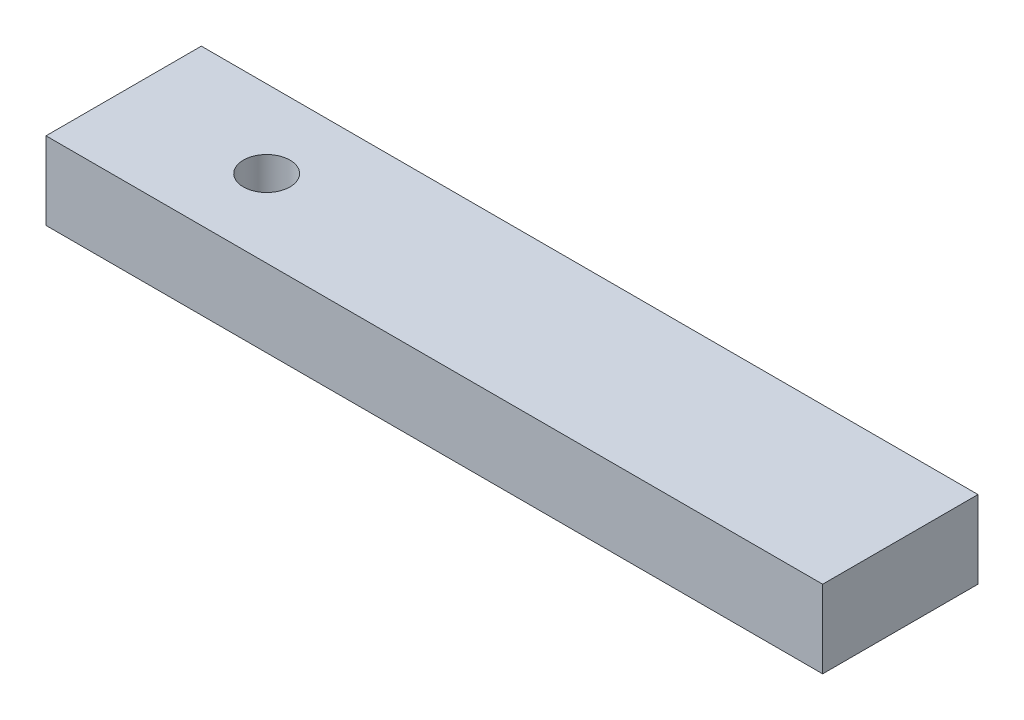
ISO-10303-21;
HEADER;
FILE_DESCRIPTION(('STEP AP214'),'2;1');
FILE_NAME('part.step','',(''),(''),'','','');
FILE_SCHEMA(('AUTOMOTIVE_DESIGN { 1 0 10303 214 1 1 1 1 }'));
ENDSEC;
DATA;
#1=APPLICATION_CONTEXT('core data for automotive mechanical design processes');
#2=APPLICATION_PROTOCOL_DEFINITION('international standard','automotive_design',2000,#1);
#3=PRODUCT_CONTEXT('',#1,'mechanical');
#4=PRODUCT('Part','Part','',(#3));
#5=PRODUCT_RELATED_PRODUCT_CATEGORY('part','',(#4));
#6=PRODUCT_DEFINITION_FORMATION('','',#4);
#7=PRODUCT_DEFINITION_CONTEXT('part definition',#1,'design');
#8=PRODUCT_DEFINITION('design','',#6,#7);
#9=PRODUCT_DEFINITION_SHAPE('','',#8);
#10=(LENGTH_UNIT() NAMED_UNIT(*) SI_UNIT(.MILLI.,.METRE.));
#11=(NAMED_UNIT(*) PLANE_ANGLE_UNIT() SI_UNIT($,.RADIAN.));
#12=(NAMED_UNIT(*) SI_UNIT($,.STERADIAN.) SOLID_ANGLE_UNIT());
#13=UNCERTAINTY_MEASURE_WITH_UNIT(LENGTH_MEASURE(1.E-05),#10,'distance_accuracy_value','');
#14=(GEOMETRIC_REPRESENTATION_CONTEXT(3) GLOBAL_UNCERTAINTY_ASSIGNED_CONTEXT((#13)) GLOBAL_UNIT_ASSIGNED_CONTEXT((#10,
#11,#12)) REPRESENTATION_CONTEXT('',''));
#15=CARTESIAN_POINT('',(0.,0.,0.));
#16=DIRECTION('',(0.,0.,1.));
#17=DIRECTION('',(1.,0.,0.));
#18=AXIS2_PLACEMENT_3D('',#15,#16,#17);
#19=CARTESIAN_POINT('',(50.,10.,-9.99999999999999));
#20=DIRECTION('',(-1.,0.,0.));
#21=DIRECTION('',(0.,0.,1.));
#22=AXIS2_PLACEMENT_3D('',#19,#20,#21);
#23=PLANE('',#22);
#24=DIRECTION('',(0.,0.,-1.));
#25=VECTOR('',#24,1.);
#26=CARTESIAN_POINT('',(50.,0.,-9.99999999999999));
#27=LINE('',#26,#25);
#28=CARTESIAN_POINT('',(50.,0.,9.99999999999999));
#29=VERTEX_POINT('',#28);
#30=CARTESIAN_POINT('',(50.,0.,-9.99999999999999));
#31=VERTEX_POINT('',#30);
#32=EDGE_CURVE('E95',#29,#31,#27,.T.);
#33=ORIENTED_EDGE('',*,*,#32,.T.);
#34=DIRECTION('',(0.,-1.,0.));
#35=VECTOR('',#34,1.);
#36=CARTESIAN_POINT('',(50.,10.,-9.99999999999999));
#37=LINE('',#36,#35);
#38=CARTESIAN_POINT('',(50.,10.,-9.99999999999999));
#39=VERTEX_POINT('',#38);
#40=EDGE_CURVE('E11',#39,#31,#37,.T.);
#41=ORIENTED_EDGE('',*,*,#40,.F.);
#42=DIRECTION('',(0.,0.,-1.));
#43=VECTOR('',#42,1.);
#44=CARTESIAN_POINT('',(50.,10.,-9.99999999999999));
#45=LINE('',#44,#43);
#46=CARTESIAN_POINT('',(50.,10.,9.99999999999999));
#47=VERTEX_POINT('',#46);
#48=EDGE_CURVE('E83',#47,#39,#45,.T.);
#49=ORIENTED_EDGE('',*,*,#48,.F.);
#50=DIRECTION('',(0.,-1.,0.));
#51=VECTOR('',#50,1.);
#52=CARTESIAN_POINT('',(50.,10.,9.99999999999999));
#53=LINE('',#52,#51);
#54=EDGE_CURVE('E91',#47,#29,#53,.T.);
#55=ORIENTED_EDGE('',*,*,#54,.T.);
#56=EDGE_LOOP('',(#33,#41,#49,#55));
#57=FACE_BOUND('',#56,.T.);
#58=ADVANCED_FACE('F32',(#57),#23,.F.);
#59=CARTESIAN_POINT('',(-50.,10.,-10.));
#60=DIRECTION('',(0.,0.,1.));
#61=DIRECTION('',(1.,0.,0.));
#62=AXIS2_PLACEMENT_3D('',#59,#60,#61);
#63=PLANE('',#62);
#64=DIRECTION('',(-1.,0.,0.));
#65=VECTOR('',#64,1.);
#66=CARTESIAN_POINT('',(-50.,0.,-10.));
#67=LINE('',#66,#65);
#68=CARTESIAN_POINT('',(-50.,0.,-10.));
#69=VERTEX_POINT('',#68);
#70=EDGE_CURVE('E87',#31,#69,#67,.T.);
#71=ORIENTED_EDGE('',*,*,#70,.T.);
#72=DIRECTION('',(0.,-1.,0.));
#73=VECTOR('',#72,1.);
#74=CARTESIAN_POINT('',(-50.,10.,-10.));
#75=LINE('',#74,#73);
#76=CARTESIAN_POINT('',(-50.,10.,-10.));
#77=VERTEX_POINT('',#76);
#78=EDGE_CURVE('E40',#77,#69,#75,.T.);
#79=ORIENTED_EDGE('',*,*,#78,.F.);
#80=DIRECTION('',(-1.,0.,0.));
#81=VECTOR('',#80,1.);
#82=CARTESIAN_POINT('',(-50.,10.,-10.));
#83=LINE('',#82,#81);
#84=EDGE_CURVE('E78',#39,#77,#83,.T.);
#85=ORIENTED_EDGE('',*,*,#84,.F.);
#86=ORIENTED_EDGE('',*,*,#40,.T.);
#87=EDGE_LOOP('',(#71,#79,#85,#86));
#88=FACE_BOUND('',#87,.T.);
#89=ADVANCED_FACE('F86',(#88),#63,.F.);
#90=CARTESIAN_POINT('',(-50.,10.,-10.));
#91=DIRECTION('',(1.,0.,0.));
#92=DIRECTION('',(0.,0.,-1.));
#93=AXIS2_PLACEMENT_3D('',#90,#91,#92);
#94=PLANE('',#93);
#95=DIRECTION('',(0.,0.,1.));
#96=VECTOR('',#95,1.);
#97=CARTESIAN_POINT('',(-50.,0.,-10.));
#98=LINE('',#97,#96);
#99=CARTESIAN_POINT('',(-50.,0.,10.));
#100=VERTEX_POINT('',#99);
#101=EDGE_CURVE('E65',#69,#100,#98,.T.);
#102=ORIENTED_EDGE('',*,*,#101,.T.);
#103=DIRECTION('',(0.,-1.,0.));
#104=VECTOR('',#103,1.);
#105=CARTESIAN_POINT('',(-50.,10.,10.));
#106=LINE('',#105,#104);
#107=CARTESIAN_POINT('',(-50.,10.,10.));
#108=VERTEX_POINT('',#107);
#109=EDGE_CURVE('E88',#108,#100,#106,.T.);
#110=ORIENTED_EDGE('',*,*,#109,.F.);
#111=DIRECTION('',(0.,0.,1.));
#112=VECTOR('',#111,1.);
#113=CARTESIAN_POINT('',(-50.,10.,-10.));
#114=LINE('',#113,#112);
#115=EDGE_CURVE('E81',#77,#108,#114,.T.);
#116=ORIENTED_EDGE('',*,*,#115,.F.);
#117=ORIENTED_EDGE('',*,*,#78,.T.);
#118=EDGE_LOOP('',(#102,#110,#116,#117));
#119=FACE_BOUND('',#118,.T.);
#120=ADVANCED_FACE('F89',(#119),#94,.F.);
#121=CARTESIAN_POINT('',(-50.,10.,10.));
#122=DIRECTION('',(0.,0.,-1.));
#123=DIRECTION('',(-1.,0.,0.));
#124=AXIS2_PLACEMENT_3D('',#121,#122,#123);
#125=PLANE('',#124);
#126=DIRECTION('',(1.,0.,0.));
#127=VECTOR('',#126,1.);
#128=CARTESIAN_POINT('',(-50.,0.,10.));
#129=LINE('',#128,#127);
#130=EDGE_CURVE('E71',#100,#29,#129,.T.);
#131=ORIENTED_EDGE('',*,*,#130,.T.);
#132=ORIENTED_EDGE('',*,*,#54,.F.);
#133=DIRECTION('',(1.,0.,0.));
#134=VECTOR('',#133,1.);
#135=CARTESIAN_POINT('',(-50.,10.,10.));
#136=LINE('',#135,#134);
#137=EDGE_CURVE('E48',#108,#47,#136,.T.);
#138=ORIENTED_EDGE('',*,*,#137,.F.);
#139=ORIENTED_EDGE('',*,*,#109,.T.);
#140=EDGE_LOOP('',(#131,#132,#138,#139));
#141=FACE_BOUND('',#140,.T.);
#142=ADVANCED_FACE('F103',(#141),#125,.F.);
#143=CARTESIAN_POINT('',(0.,10.,0.));
#144=DIRECTION('',(0.,1.,0.));
#145=DIRECTION('',(0.,0.,1.));
#146=AXIS2_PLACEMENT_3D('',#143,#144,#145);
#147=PLANE('',#146);
#148=CARTESIAN_POINT('',(-31.5891666482288,10.,0.));
#149=DIRECTION('',(0.,1.,0.));
#150=DIRECTION('',(0.,0.,1.));
#151=AXIS2_PLACEMENT_3D('',#148,#149,#150);
#152=CIRCLE('',#151,3.);
#153=CARTESIAN_POINT('',(-31.5891666482288,10.,3.00000000000001));
#154=VERTEX_POINT('',#153);
#155=EDGE_CURVE('E109',#154,#154,#152,.T.);
#156=ORIENTED_EDGE('',*,*,#155,.F.);
#157=EDGE_LOOP('',(#156));
#158=FACE_BOUND('',#157,.T.);
#159=ORIENTED_EDGE('',*,*,#48,.T.);
#160=ORIENTED_EDGE('',*,*,#84,.T.);
#161=ORIENTED_EDGE('',*,*,#115,.T.);
#162=ORIENTED_EDGE('',*,*,#137,.T.);
#163=EDGE_LOOP('',(#159,#160,#161,#162));
#164=FACE_BOUND('',#163,.T.);
#165=ADVANCED_FACE('F79',(#158,#164),#147,.T.);
#166=CARTESIAN_POINT('',(0.,0.,0.));
#167=DIRECTION('',(0.,1.,0.));
#168=DIRECTION('',(0.,0.,1.));
#169=AXIS2_PLACEMENT_3D('',#166,#167,#168);
#170=PLANE('',#169);
#171=CARTESIAN_POINT('',(-31.5891666482288,0.,0.));
#172=DIRECTION('',(0.,1.,0.));
#173=DIRECTION('',(0.,0.,1.));
#174=AXIS2_PLACEMENT_3D('',#171,#172,#173);
#175=CIRCLE('',#174,3.);
#176=CARTESIAN_POINT('',(-31.5891666482288,0.,3.00000000000001));
#177=VERTEX_POINT('',#176);
#178=EDGE_CURVE('E98',#177,#177,#175,.T.);
#179=ORIENTED_EDGE('',*,*,#178,.T.);
#180=EDGE_LOOP('',(#179));
#181=FACE_BOUND('',#180,.T.);
#182=ORIENTED_EDGE('',*,*,#32,.F.);
#183=ORIENTED_EDGE('',*,*,#130,.F.);
#184=ORIENTED_EDGE('',*,*,#101,.F.);
#185=ORIENTED_EDGE('',*,*,#70,.F.);
#186=EDGE_LOOP('',(#182,#183,#184,#185));
#187=FACE_BOUND('',#186,.T.);
#188=ADVANCED_FACE('F106',(#181,#187),#170,.F.);
#189=CARTESIAN_POINT('',(-31.5891666482288,0.,0.));
#190=DIRECTION('',(0.,1.,0.));
#191=DIRECTION('',(0.,0.,1.));
#192=AXIS2_PLACEMENT_3D('',#189,#190,#191);
#193=CYLINDRICAL_SURFACE('',#192,3.);
#194=ORIENTED_EDGE('',*,*,#178,.F.);
#195=EDGE_LOOP('',(#194));
#196=FACE_BOUND('',#195,.T.);
#197=ORIENTED_EDGE('',*,*,#155,.T.);
#198=EDGE_LOOP('',(#197));
#199=FACE_BOUND('',#198,.T.);
#200=ADVANCED_FACE('F116',(#196,#199),#193,.F.);
#201=CLOSED_SHELL('',(#58,#89,#120,#142,#165,#188,#200));
#202=MANIFOLD_SOLID_BREP('B2',#201);
#203=ADVANCED_BREP_SHAPE_REPRESENTATION('',(#18,#202),#14);
#204=SHAPE_DEFINITION_REPRESENTATION(#9,#203);
ENDSEC;
END-ISO-10303-21;
